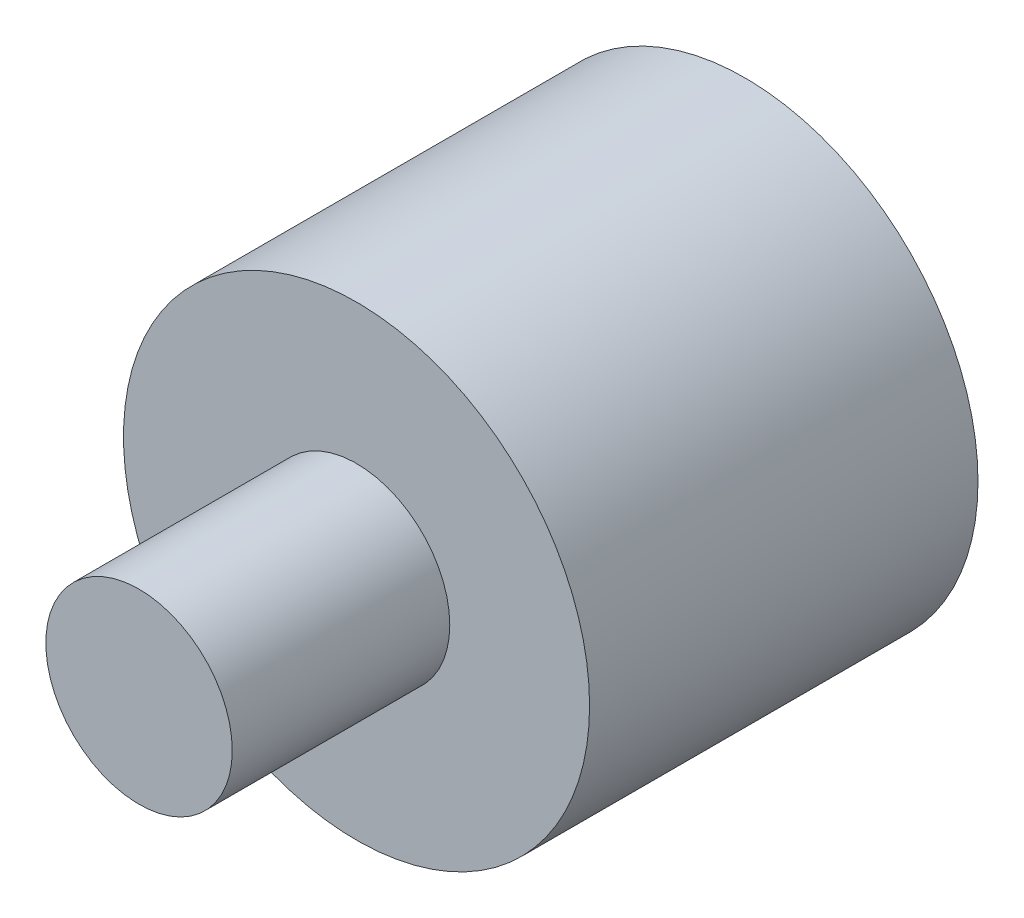
ISO-10303-21;
HEADER;
FILE_DESCRIPTION(('STEP AP214'),'2;1');
FILE_NAME('part.step','',(''),(''),'','','');
FILE_SCHEMA(('AUTOMOTIVE_DESIGN { 1 0 10303 214 1 1 1 1 }'));
ENDSEC;
DATA;
#1=APPLICATION_CONTEXT('core data for automotive mechanical design processes');
#2=APPLICATION_PROTOCOL_DEFINITION('international standard','automotive_design',2000,#1);
#3=PRODUCT_CONTEXT('',#1,'mechanical');
#4=PRODUCT('Part','Part','',(#3));
#5=PRODUCT_RELATED_PRODUCT_CATEGORY('part','',(#4));
#6=PRODUCT_DEFINITION_FORMATION('','',#4);
#7=PRODUCT_DEFINITION_CONTEXT('part definition',#1,'design');
#8=PRODUCT_DEFINITION('design','',#6,#7);
#9=PRODUCT_DEFINITION_SHAPE('','',#8);
#10=(LENGTH_UNIT() NAMED_UNIT(*) SI_UNIT(.MILLI.,.METRE.));
#11=(NAMED_UNIT(*) PLANE_ANGLE_UNIT() SI_UNIT($,.RADIAN.));
#12=(NAMED_UNIT(*) SI_UNIT($,.STERADIAN.) SOLID_ANGLE_UNIT());
#13=UNCERTAINTY_MEASURE_WITH_UNIT(LENGTH_MEASURE(1.E-05),#10,'distance_accuracy_value','');
#14=(GEOMETRIC_REPRESENTATION_CONTEXT(3) GLOBAL_UNCERTAINTY_ASSIGNED_CONTEXT((#13)) GLOBAL_UNIT_ASSIGNED_CONTEXT((#10,
#11,#12)) REPRESENTATION_CONTEXT('',''));
#15=CARTESIAN_POINT('',(0.,0.,0.));
#16=DIRECTION('',(0.,0.,1.));
#17=DIRECTION('',(1.,0.,0.));
#18=AXIS2_PLACEMENT_3D('',#15,#16,#17);
#19=CARTESIAN_POINT('',(0.,0.,12.5));
#20=DIRECTION('',(0.,0.,-1.));
#21=DIRECTION('',(-1.,0.,0.));
#22=AXIS2_PLACEMENT_3D('',#19,#20,#21);
#23=CYLINDRICAL_SURFACE('',#22,7.5);
#24=CARTESIAN_POINT('',(0.,0.,12.5));
#25=DIRECTION('',(0.,0.,1.));
#26=DIRECTION('',(1.,0.,0.));
#27=AXIS2_PLACEMENT_3D('',#24,#25,#26);
#28=CIRCLE('',#27,7.5);
#29=CARTESIAN_POINT('',(7.5,0.,12.5));
#30=VERTEX_POINT('',#29);
#31=EDGE_CURVE('E45',#30,#30,#28,.T.);
#32=ORIENTED_EDGE('',*,*,#31,.F.);
#33=EDGE_LOOP('',(#32));
#34=FACE_BOUND('',#33,.T.);
#35=CARTESIAN_POINT('',(0.,0.,0.));
#36=DIRECTION('',(0.,0.,1.));
#37=DIRECTION('',(1.,0.,0.));
#38=AXIS2_PLACEMENT_3D('',#35,#36,#37);
#39=CIRCLE('',#38,7.5);
#40=CARTESIAN_POINT('',(7.5,0.,0.));
#41=VERTEX_POINT('',#40);
#42=EDGE_CURVE('E40',#41,#41,#39,.T.);
#43=ORIENTED_EDGE('',*,*,#42,.T.);
#44=EDGE_LOOP('',(#43));
#45=FACE_BOUND('',#44,.T.);
#46=ADVANCED_FACE('F37',(#34,#45),#23,.T.);
#47=CARTESIAN_POINT('',(0.,0.,12.5));
#48=DIRECTION('',(0.,0.,1.));
#49=DIRECTION('',(1.,0.,0.));
#50=AXIS2_PLACEMENT_3D('',#47,#48,#49);
#51=PLANE('',#50);
#52=CARTESIAN_POINT('',(0.,0.,12.5));
#53=DIRECTION('',(0.,0.,1.));
#54=DIRECTION('',(1.,0.,0.));
#55=AXIS2_PLACEMENT_3D('',#52,#53,#54);
#56=CIRCLE('',#55,3.);
#57=CARTESIAN_POINT('',(3.,0.,12.5));
#58=VERTEX_POINT('',#57);
#59=EDGE_CURVE('E10',#58,#58,#56,.T.);
#60=ORIENTED_EDGE('',*,*,#59,.F.);
#61=EDGE_LOOP('',(#60));
#62=FACE_BOUND('',#61,.T.);
#63=ORIENTED_EDGE('',*,*,#31,.T.);
#64=EDGE_LOOP('',(#63));
#65=FACE_BOUND('',#64,.T.);
#66=ADVANCED_FACE('F65',(#62,#65),#51,.T.);
#67=CARTESIAN_POINT('',(0.,0.,0.));
#68=DIRECTION('',(0.,0.,1.));
#69=DIRECTION('',(1.,0.,0.));
#70=AXIS2_PLACEMENT_3D('',#67,#68,#69);
#71=PLANE('',#70);
#72=ORIENTED_EDGE('',*,*,#42,.F.);
#73=EDGE_LOOP('',(#72));
#74=FACE_BOUND('',#73,.T.);
#75=ADVANCED_FACE('F62',(#74),#71,.F.);
#76=CARTESIAN_POINT('',(0.,0.,19.5));
#77=DIRECTION('',(0.,0.,-1.));
#78=DIRECTION('',(-1.,0.,0.));
#79=AXIS2_PLACEMENT_3D('',#76,#77,#78);
#80=CYLINDRICAL_SURFACE('',#79,3.);
#81=CARTESIAN_POINT('',(0.,0.,19.5));
#82=DIRECTION('',(0.,0.,1.));
#83=DIRECTION('',(1.,0.,0.));
#84=AXIS2_PLACEMENT_3D('',#81,#82,#83);
#85=CIRCLE('',#84,3.);
#86=CARTESIAN_POINT('',(3.,0.,19.5));
#87=VERTEX_POINT('',#86);
#88=EDGE_CURVE('E52',#87,#87,#85,.T.);
#89=ORIENTED_EDGE('',*,*,#88,.F.);
#90=EDGE_LOOP('',(#89));
#91=FACE_BOUND('',#90,.T.);
#92=ORIENTED_EDGE('',*,*,#59,.T.);
#93=EDGE_LOOP('',(#92));
#94=FACE_BOUND('',#93,.T.);
#95=ADVANCED_FACE('F64',(#91,#94),#80,.T.);
#96=CARTESIAN_POINT('',(0.,0.,19.5));
#97=DIRECTION('',(0.,0.,1.));
#98=DIRECTION('',(1.,0.,0.));
#99=AXIS2_PLACEMENT_3D('',#96,#97,#98);
#100=PLANE('',#99);
#101=ORIENTED_EDGE('',*,*,#88,.T.);
#102=EDGE_LOOP('',(#101));
#103=FACE_BOUND('',#102,.T.);
#104=ADVANCED_FACE('F70',(#103),#100,.T.);
#105=CLOSED_SHELL('',(#46,#66,#75,#95,#104));
#106=MANIFOLD_SOLID_BREP('B2',#105);
#107=ADVANCED_BREP_SHAPE_REPRESENTATION('',(#18,#106),#14);
#108=SHAPE_DEFINITION_REPRESENTATION(#9,#107);
ENDSEC;
END-ISO-10303-21;
